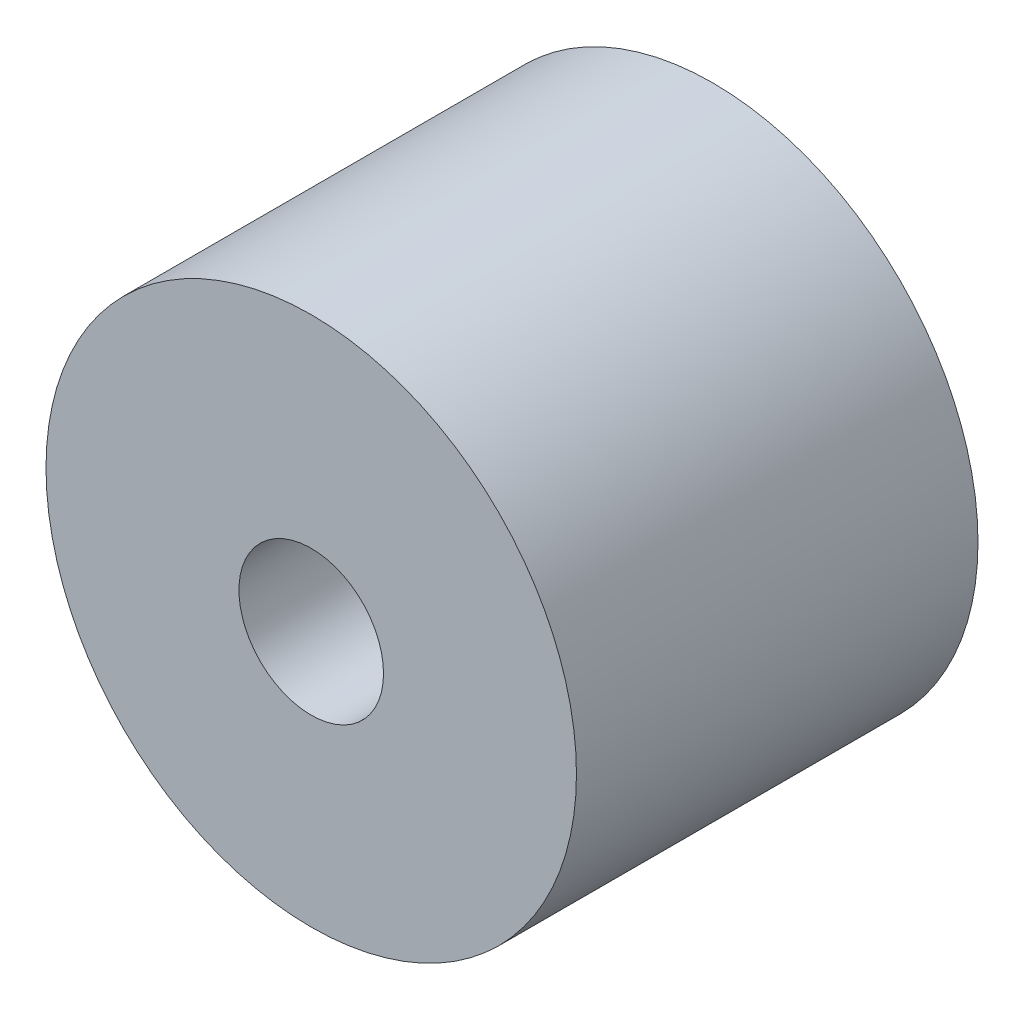
ISO-10303-21;
HEADER;
FILE_DESCRIPTION(('STEP AP214'),'2;1');
FILE_NAME('part.step','',(''),(''),'','','');
FILE_SCHEMA(('AUTOMOTIVE_DESIGN { 1 0 10303 214 1 1 1 1 }'));
ENDSEC;
DATA;
#1=APPLICATION_CONTEXT('core data for automotive mechanical design processes');
#2=APPLICATION_PROTOCOL_DEFINITION('international standard','automotive_design',2000,#1);
#3=PRODUCT_CONTEXT('',#1,'mechanical');
#4=PRODUCT('Part','Part','',(#3));
#5=PRODUCT_RELATED_PRODUCT_CATEGORY('part','',(#4));
#6=PRODUCT_DEFINITION_FORMATION('','',#4);
#7=PRODUCT_DEFINITION_CONTEXT('part definition',#1,'design');
#8=PRODUCT_DEFINITION('design','',#6,#7);
#9=PRODUCT_DEFINITION_SHAPE('','',#8);
#10=(LENGTH_UNIT() NAMED_UNIT(*) SI_UNIT(.MILLI.,.METRE.));
#11=(NAMED_UNIT(*) PLANE_ANGLE_UNIT() SI_UNIT($,.RADIAN.));
#12=(NAMED_UNIT(*) SI_UNIT($,.STERADIAN.) SOLID_ANGLE_UNIT());
#13=UNCERTAINTY_MEASURE_WITH_UNIT(LENGTH_MEASURE(1.E-05),#10,'distance_accuracy_value','');
#14=(GEOMETRIC_REPRESENTATION_CONTEXT(3) GLOBAL_UNCERTAINTY_ASSIGNED_CONTEXT((#13)) GLOBAL_UNIT_ASSIGNED_CONTEXT((#10,
#11,#12)) REPRESENTATION_CONTEXT('',''));
#15=CARTESIAN_POINT('',(0.,0.,0.));
#16=DIRECTION('',(0.,0.,1.));
#17=DIRECTION('',(1.,0.,0.));
#18=AXIS2_PLACEMENT_3D('',#15,#16,#17);
#19=CARTESIAN_POINT('',(0.,-2.37274116005892,52.));
#20=DIRECTION('',(0.,0.,-1.));
#21=DIRECTION('',(-1.,0.,0.));
#22=AXIS2_PLACEMENT_3D('',#19,#20,#21);
#23=CYLINDRICAL_SURFACE('',#22,34.3491083638299);
#24=CARTESIAN_POINT('',(0.,-2.37274116005892,52.));
#25=DIRECTION('',(0.,0.,1.));
#26=DIRECTION('',(1.,0.,0.));
#27=AXIS2_PLACEMENT_3D('',#24,#25,#26);
#28=CIRCLE('',#27,34.3491083638299);
#29=CARTESIAN_POINT('',(34.3491083638299,-2.37274116005892,52.));
#30=VERTEX_POINT('',#29);
#31=EDGE_CURVE('E10',#30,#30,#28,.T.);
#32=ORIENTED_EDGE('',*,*,#31,.F.);
#33=EDGE_LOOP('',(#32));
#34=FACE_BOUND('',#33,.T.);
#35=CARTESIAN_POINT('',(0.,-2.37274116005892,0.));
#36=DIRECTION('',(0.,0.,1.));
#37=DIRECTION('',(1.,0.,0.));
#38=AXIS2_PLACEMENT_3D('',#35,#36,#37);
#39=CIRCLE('',#38,34.3491083638299);
#40=CARTESIAN_POINT('',(34.3491083638299,-2.37274116005892,0.));
#41=VERTEX_POINT('',#40);
#42=EDGE_CURVE('E39',#41,#41,#39,.T.);
#43=ORIENTED_EDGE('',*,*,#42,.T.);
#44=EDGE_LOOP('',(#43));
#45=FACE_BOUND('',#44,.T.);
#46=ADVANCED_FACE('F36',(#34,#45),#23,.T.);
#47=CARTESIAN_POINT('',(0.,-2.37274116005892,52.));
#48=DIRECTION('',(0.,0.,1.));
#49=DIRECTION('',(1.,0.,0.));
#50=AXIS2_PLACEMENT_3D('',#47,#48,#49);
#51=PLANE('',#50);
#52=CARTESIAN_POINT('',(0.,-3.58854743344395,52.));
#53=DIRECTION('',(0.,0.,1.));
#54=DIRECTION('',(1.,0.,0.));
#55=AXIS2_PLACEMENT_3D('',#52,#53,#54);
#56=CIRCLE('',#55,9.3608963475017);
#57=CARTESIAN_POINT('',(9.3608963475017,-3.58854743344395,52.));
#58=VERTEX_POINT('',#57);
#59=EDGE_CURVE('E48',#58,#58,#56,.T.);
#60=ORIENTED_EDGE('',*,*,#59,.F.);
#61=EDGE_LOOP('',(#60));
#62=FACE_BOUND('',#61,.T.);
#63=ORIENTED_EDGE('',*,*,#31,.T.);
#64=EDGE_LOOP('',(#63));
#65=FACE_BOUND('',#64,.T.);
#66=ADVANCED_FACE('F63',(#62,#65),#51,.T.);
#67=CARTESIAN_POINT('',(0.,-2.37274116005892,0.));
#68=DIRECTION('',(0.,0.,1.));
#69=DIRECTION('',(1.,0.,0.));
#70=AXIS2_PLACEMENT_3D('',#67,#68,#69);
#71=PLANE('',#70);
#72=CARTESIAN_POINT('',(0.,-3.58854743344395,0.));
#73=DIRECTION('',(0.,0.,1.));
#74=DIRECTION('',(1.,0.,0.));
#75=AXIS2_PLACEMENT_3D('',#72,#73,#74);
#76=CIRCLE('',#75,9.3608963475017);
#77=CARTESIAN_POINT('',(9.3608963475017,-3.58854743344395,0.));
#78=VERTEX_POINT('',#77);
#79=EDGE_CURVE('E46',#78,#78,#76,.T.);
#80=ORIENTED_EDGE('',*,*,#79,.T.);
#81=EDGE_LOOP('',(#80));
#82=FACE_BOUND('',#81,.T.);
#83=ORIENTED_EDGE('',*,*,#42,.F.);
#84=EDGE_LOOP('',(#83));
#85=FACE_BOUND('',#84,.T.);
#86=ADVANCED_FACE('F54',(#82,#85),#71,.F.);
#87=CARTESIAN_POINT('',(0.,-3.58854743344395,0.));
#88=DIRECTION('',(0.,0.,1.));
#89=DIRECTION('',(1.,0.,0.));
#90=AXIS2_PLACEMENT_3D('',#87,#88,#89);
#91=CYLINDRICAL_SURFACE('',#90,9.3608963475017);
#92=ORIENTED_EDGE('',*,*,#79,.F.);
#93=EDGE_LOOP('',(#92));
#94=FACE_BOUND('',#93,.T.);
#95=ORIENTED_EDGE('',*,*,#59,.T.);
#96=EDGE_LOOP('',(#95));
#97=FACE_BOUND('',#96,.T.);
#98=ADVANCED_FACE('F57',(#94,#97),#91,.F.);
#99=CLOSED_SHELL('',(#46,#66,#86,#98));
#100=MANIFOLD_SOLID_BREP('B2',#99);
#101=ADVANCED_BREP_SHAPE_REPRESENTATION('',(#18,#100),#14);
#102=SHAPE_DEFINITION_REPRESENTATION(#9,#101);
ENDSEC;
END-ISO-10303-21;
